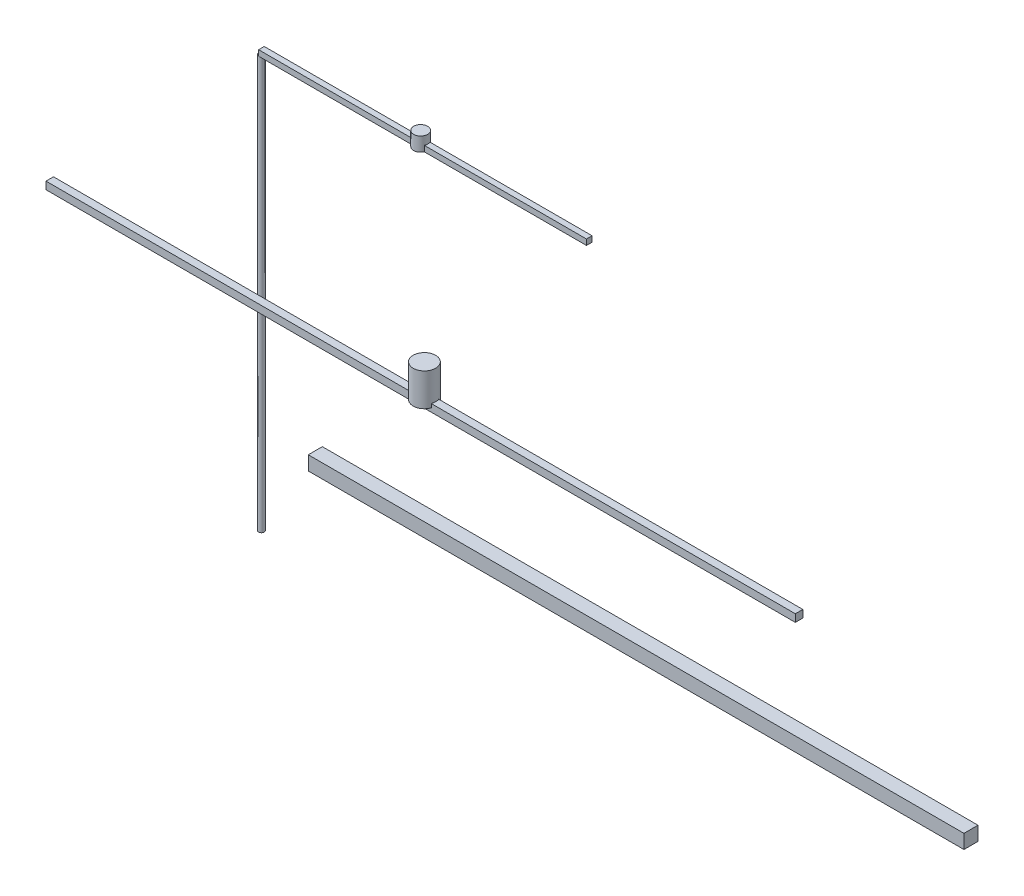
ISO-10303-21;
HEADER;
FILE_DESCRIPTION(('STEP AP214'),'2;1');
FILE_NAME('part.step','',(''),(''),'','','');
FILE_SCHEMA(('AUTOMOTIVE_DESIGN { 1 0 10303 214 1 1 1 1 }'));
ENDSEC;
DATA;
#1=APPLICATION_CONTEXT('core data for automotive mechanical design processes');
#2=APPLICATION_PROTOCOL_DEFINITION('international standard','automotive_design',2000,#1);
#3=PRODUCT_CONTEXT('',#1,'mechanical');
#4=PRODUCT('Part','Part','',(#3));
#5=PRODUCT_RELATED_PRODUCT_CATEGORY('part','',(#4));
#6=PRODUCT_DEFINITION_FORMATION('','',#4);
#7=PRODUCT_DEFINITION_CONTEXT('part definition',#1,'design');
#8=PRODUCT_DEFINITION('design','',#6,#7);
#9=PRODUCT_DEFINITION_SHAPE('','',#8);
#10=(LENGTH_UNIT() NAMED_UNIT(*) SI_UNIT(.MILLI.,.METRE.));
#11=(NAMED_UNIT(*) PLANE_ANGLE_UNIT() SI_UNIT($,.RADIAN.));
#12=(NAMED_UNIT(*) SI_UNIT($,.STERADIAN.) SOLID_ANGLE_UNIT());
#13=UNCERTAINTY_MEASURE_WITH_UNIT(LENGTH_MEASURE(1.E-05),#10,'distance_accuracy_value','');
#14=(GEOMETRIC_REPRESENTATION_CONTEXT(3) GLOBAL_UNCERTAINTY_ASSIGNED_CONTEXT((#13)) GLOBAL_UNIT_ASSIGNED_CONTEXT((#10,
#11,#12)) REPRESENTATION_CONTEXT('',''));
#15=CARTESIAN_POINT('',(0.,0.,0.));
#16=DIRECTION('',(0.,0.,1.));
#17=DIRECTION('',(1.,0.,0.));
#18=AXIS2_PLACEMENT_3D('',#15,#16,#17);
#19=CARTESIAN_POINT('',(-3500.,450.,-500.));
#20=DIRECTION('',(1.,0.,0.));
#21=DIRECTION('',(0.,0.,-1.));
#22=AXIS2_PLACEMENT_3D('',#19,#20,#21);
#23=PLANE('',#22);
#24=DIRECTION('',(0.,0.,1.));
#25=VECTOR('',#24,1.);
#26=CARTESIAN_POINT('',(-3500.,300.,-500.));
#27=LINE('',#26,#25);
#28=CARTESIAN_POINT('',(-3500.,300.,-650.));
#29=VERTEX_POINT('',#28);
#30=CARTESIAN_POINT('',(-3500.,300.,-500.));
#31=VERTEX_POINT('',#30);
#32=EDGE_CURVE('E113',#29,#31,#27,.T.);
#33=ORIENTED_EDGE('',*,*,#32,.T.);
#34=DIRECTION('',(0.,-1.,0.));
#35=VECTOR('',#34,1.);
#36=CARTESIAN_POINT('',(-3500.,450.,-500.));
#37=LINE('',#36,#35);
#38=CARTESIAN_POINT('',(-3500.,450.,-500.));
#39=VERTEX_POINT('',#38);
#40=EDGE_CURVE('E12',#39,#31,#37,.T.);
#41=ORIENTED_EDGE('',*,*,#40,.F.);
#42=DIRECTION('',(0.,0.,1.));
#43=VECTOR('',#42,1.);
#44=CARTESIAN_POINT('',(-3500.,450.,-500.));
#45=LINE('',#44,#43);
#46=CARTESIAN_POINT('',(-3500.,450.,-650.));
#47=VERTEX_POINT('',#46);
#48=EDGE_CURVE('E101',#47,#39,#45,.T.);
#49=ORIENTED_EDGE('',*,*,#48,.F.);
#50=DIRECTION('',(0.,-1.,0.));
#51=VECTOR('',#50,1.);
#52=CARTESIAN_POINT('',(-3500.,450.,-650.));
#53=LINE('',#52,#51);
#54=EDGE_CURVE('E109',#47,#29,#53,.T.);
#55=ORIENTED_EDGE('',*,*,#54,.T.);
#56=EDGE_LOOP('',(#33,#41,#49,#55));
#57=FACE_BOUND('',#56,.T.);
#58=ADVANCED_FACE('F50',(#57),#23,.F.);
#59=CARTESIAN_POINT('',(-3500.,450.,-500.));
#60=DIRECTION('',(0.,0.,-1.));
#61=DIRECTION('',(-1.,0.,0.));
#62=AXIS2_PLACEMENT_3D('',#59,#60,#61);
#63=PLANE('',#62);
#64=DIRECTION('',(1.,0.,0.));
#65=VECTOR('',#64,1.);
#66=CARTESIAN_POINT('',(-3500.,300.,-500.));
#67=LINE('',#66,#65);
#68=CARTESIAN_POINT('',(3500.,300.,-500.));
#69=VERTEX_POINT('',#68);
#70=EDGE_CURVE('E105',#31,#69,#67,.T.);
#71=ORIENTED_EDGE('',*,*,#70,.T.);
#72=DIRECTION('',(0.,-1.,0.));
#73=VECTOR('',#72,1.);
#74=CARTESIAN_POINT('',(3500.,450.,-500.));
#75=LINE('',#74,#73);
#76=CARTESIAN_POINT('',(3500.,450.,-500.));
#77=VERTEX_POINT('',#76);
#78=EDGE_CURVE('E58',#77,#69,#75,.T.);
#79=ORIENTED_EDGE('',*,*,#78,.F.);
#80=DIRECTION('',(1.,0.,0.));
#81=VECTOR('',#80,1.);
#82=CARTESIAN_POINT('',(-3500.,450.,-500.));
#83=LINE('',#82,#81);
#84=EDGE_CURVE('E96',#39,#77,#83,.T.);
#85=ORIENTED_EDGE('',*,*,#84,.F.);
#86=ORIENTED_EDGE('',*,*,#40,.T.);
#87=EDGE_LOOP('',(#71,#79,#85,#86));
#88=FACE_BOUND('',#87,.T.);
#89=ADVANCED_FACE('F104',(#88),#63,.F.);
#90=CARTESIAN_POINT('',(3500.,450.,-500.));
#91=DIRECTION('',(-1.,0.,0.));
#92=DIRECTION('',(0.,0.,1.));
#93=AXIS2_PLACEMENT_3D('',#90,#91,#92);
#94=PLANE('',#93);
#95=DIRECTION('',(0.,0.,-1.));
#96=VECTOR('',#95,1.);
#97=CARTESIAN_POINT('',(3500.,300.,-500.));
#98=LINE('',#97,#96);
#99=CARTESIAN_POINT('',(3500.,300.,-650.));
#100=VERTEX_POINT('',#99);
#101=EDGE_CURVE('E83',#69,#100,#98,.T.);
#102=ORIENTED_EDGE('',*,*,#101,.T.);
#103=DIRECTION('',(0.,-1.,0.));
#104=VECTOR('',#103,1.);
#105=CARTESIAN_POINT('',(3500.,450.,-650.));
#106=LINE('',#105,#104);
#107=CARTESIAN_POINT('',(3500.,450.,-650.));
#108=VERTEX_POINT('',#107);
#109=EDGE_CURVE('E106',#108,#100,#106,.T.);
#110=ORIENTED_EDGE('',*,*,#109,.F.);
#111=DIRECTION('',(0.,0.,-1.));
#112=VECTOR('',#111,1.);
#113=CARTESIAN_POINT('',(3500.,450.,-500.));
#114=LINE('',#113,#112);
#115=EDGE_CURVE('E99',#77,#108,#114,.T.);
#116=ORIENTED_EDGE('',*,*,#115,.F.);
#117=ORIENTED_EDGE('',*,*,#78,.T.);
#118=EDGE_LOOP('',(#102,#110,#116,#117));
#119=FACE_BOUND('',#118,.T.);
#120=ADVANCED_FACE('F107',(#119),#94,.F.);
#121=CARTESIAN_POINT('',(-3500.,450.,-650.));
#122=DIRECTION('',(0.,0.,1.));
#123=DIRECTION('',(1.,0.,0.));
#124=AXIS2_PLACEMENT_3D('',#121,#122,#123);
#125=PLANE('',#124);
#126=DIRECTION('',(-1.,0.,0.));
#127=VECTOR('',#126,1.);
#128=CARTESIAN_POINT('',(-3500.,300.,-650.));
#129=LINE('',#128,#127);
#130=EDGE_CURVE('E89',#100,#29,#129,.T.);
#131=ORIENTED_EDGE('',*,*,#130,.T.);
#132=ORIENTED_EDGE('',*,*,#54,.F.);
#133=DIRECTION('',(-1.,0.,0.));
#134=VECTOR('',#133,1.);
#135=CARTESIAN_POINT('',(-3500.,450.,-650.));
#136=LINE('',#135,#134);
#137=EDGE_CURVE('E66',#108,#47,#136,.T.);
#138=ORIENTED_EDGE('',*,*,#137,.F.);
#139=ORIENTED_EDGE('',*,*,#109,.T.);
#140=EDGE_LOOP('',(#131,#132,#138,#139));
#141=FACE_BOUND('',#140,.T.);
#142=ADVANCED_FACE('F120',(#141),#125,.F.);
#143=CARTESIAN_POINT('',(0.,450.,0.));
#144=DIRECTION('',(0.,-1.,0.));
#145=DIRECTION('',(0.,0.,-1.));
#146=AXIS2_PLACEMENT_3D('',#143,#144,#145);
#147=PLANE('',#146);
#148=ORIENTED_EDGE('',*,*,#48,.T.);
#149=ORIENTED_EDGE('',*,*,#84,.T.);
#150=ORIENTED_EDGE('',*,*,#115,.T.);
#151=ORIENTED_EDGE('',*,*,#137,.T.);
#152=EDGE_LOOP('',(#148,#149,#150,#151));
#153=FACE_BOUND('',#152,.T.);
#154=ADVANCED_FACE('F97',(#153),#147,.F.);
#155=CARTESIAN_POINT('',(0.,300.,0.));
#156=DIRECTION('',(0.,-1.,0.));
#157=DIRECTION('',(0.,0.,-1.));
#158=AXIS2_PLACEMENT_3D('',#155,#156,#157);
#159=PLANE('',#158);
#160=ORIENTED_EDGE('',*,*,#32,.F.);
#161=ORIENTED_EDGE('',*,*,#130,.F.);
#162=ORIENTED_EDGE('',*,*,#101,.F.);
#163=ORIENTED_EDGE('',*,*,#70,.F.);
#164=EDGE_LOOP('',(#160,#161,#162,#163));
#165=FACE_BOUND('',#164,.T.);
#166=ADVANCED_FACE('F123',(#165),#159,.T.);
#167=CLOSED_SHELL('',(#58,#89,#120,#142,#154,#166));
#168=MANIFOLD_SOLID_BREP('B2',#167);
#169=CARTESIAN_POINT('',(-4000.,3880.,1800.));
#170=DIRECTION('',(0.,0.,-1.));
#171=DIRECTION('',(-1.,0.,0.));
#172=AXIS2_PLACEMENT_3D('',#169,#170,#171);
#173=PLANE('',#172);
#174=DIRECTION('',(0.,-1.,0.));
#175=VECTOR('',#174,1.);
#176=CARTESIAN_POINT('',(113.137084989848,4190.,1800.));
#177=LINE('',#176,#175);
#178=CARTESIAN_POINT('',(113.137084989848,3840.,1800.));
#179=VERTEX_POINT('',#178);
#180=CARTESIAN_POINT('',(113.137084989848,3880.,1800.));
#181=VERTEX_POINT('',#180);
#182=EDGE_CURVE('E198',#179,#181,#177,.F.);
#183=ORIENTED_EDGE('',*,*,#182,.F.);
#184=DIRECTION('',(1.,0.,0.));
#185=VECTOR('',#184,1.);
#186=CARTESIAN_POINT('',(-4000.,3840.,1800.));
#187=LINE('',#186,#185);
#188=CARTESIAN_POINT('',(-113.137084989848,3840.,1800.));
#189=VERTEX_POINT('',#188);
#190=EDGE_CURVE('E202',#189,#179,#187,.T.);
#191=ORIENTED_EDGE('',*,*,#190,.F.);
#192=DIRECTION('',(0.,-1.,0.));
#193=VECTOR('',#192,1.);
#194=CARTESIAN_POINT('',(-113.137084989848,4190.,1800.));
#195=LINE('',#194,#193);
#196=CARTESIAN_POINT('',(-113.137084989848,3880.,1800.));
#197=VERTEX_POINT('',#196);
#198=EDGE_CURVE('E299',#197,#189,#195,.T.);
#199=ORIENTED_EDGE('',*,*,#198,.F.);
#200=DIRECTION('',(1.,0.,0.));
#201=VECTOR('',#200,1.);
#202=CARTESIAN_POINT('',(-4000.,3880.,1800.));
#203=LINE('',#202,#201);
#204=CARTESIAN_POINT('',(-4000.,3880.,1800.));
#205=VERTEX_POINT('',#204);
#206=EDGE_CURVE('E292',#205,#197,#203,.T.);
#207=ORIENTED_EDGE('',*,*,#206,.F.);
#208=DIRECTION('',(0.,-1.,0.));
#209=VECTOR('',#208,1.);
#210=CARTESIAN_POINT('',(-4000.,3880.,1800.));
#211=LINE('',#210,#209);
#212=CARTESIAN_POINT('',(-4000.,3800.,1800.));
#213=VERTEX_POINT('',#212);
#214=EDGE_CURVE('E270',#205,#213,#211,.T.);
#215=ORIENTED_EDGE('',*,*,#214,.T.);
#216=DIRECTION('',(1.,0.,0.));
#217=VECTOR('',#216,1.);
#218=CARTESIAN_POINT('',(-4000.,3800.,1800.));
#219=LINE('',#218,#217);
#220=CARTESIAN_POINT('',(4000.,3800.,1800.));
#221=VERTEX_POINT('',#220);
#222=EDGE_CURVE('E286',#213,#221,#219,.T.);
#223=ORIENTED_EDGE('',*,*,#222,.T.);
#224=DIRECTION('',(0.,-1.,0.));
#225=VECTOR('',#224,1.);
#226=CARTESIAN_POINT('',(4000.,3880.,1800.));
#227=LINE('',#226,#225);
#228=CARTESIAN_POINT('',(4000.,3880.,1800.));
#229=VERTEX_POINT('',#228);
#230=EDGE_CURVE('E272',#229,#221,#227,.T.);
#231=ORIENTED_EDGE('',*,*,#230,.F.);
#232=EDGE_CURVE('E295',#181,#229,#203,.T.);
#233=ORIENTED_EDGE('',*,*,#232,.F.);
#234=EDGE_LOOP('',(#183,#191,#199,#207,#215,#223,#231,#233));
#235=FACE_BOUND('',#234,.T.);
#236=ADVANCED_FACE('F183',(#235),#173,.F.);
#237=CARTESIAN_POINT('',(-4000.,3880.,1720.));
#238=DIRECTION('',(0.,0.,1.));
#239=DIRECTION('',(1.,0.,0.));
#240=AXIS2_PLACEMENT_3D('',#237,#238,#239);
#241=PLANE('',#240);
#242=DIRECTION('',(0.,-1.,0.));
#243=VECTOR('',#242,1.);
#244=CARTESIAN_POINT('',(-113.137084989848,4190.,1720.));
#245=LINE('',#244,#243);
#246=CARTESIAN_POINT('',(-113.137084989848,3840.,1720.));
#247=VERTEX_POINT('',#246);
#248=CARTESIAN_POINT('',(-113.137084989848,3880.,1720.));
#249=VERTEX_POINT('',#248);
#250=EDGE_CURVE('E301',#247,#249,#245,.F.);
#251=ORIENTED_EDGE('',*,*,#250,.F.);
#252=DIRECTION('',(-1.,0.,0.));
#253=VECTOR('',#252,1.);
#254=CARTESIAN_POINT('',(-4000.,3840.,1720.));
#255=LINE('',#254,#253);
#256=CARTESIAN_POINT('',(113.137084989848,3840.,1720.));
#257=VERTEX_POINT('',#256);
#258=EDGE_CURVE('E48',#257,#247,#255,.T.);
#259=ORIENTED_EDGE('',*,*,#258,.F.);
#260=DIRECTION('',(0.,-1.,0.));
#261=VECTOR('',#260,1.);
#262=CARTESIAN_POINT('',(113.137084989848,4190.,1720.));
#263=LINE('',#262,#261);
#264=CARTESIAN_POINT('',(113.137084989848,3880.,1720.));
#265=VERTEX_POINT('',#264);
#266=EDGE_CURVE('E260',#265,#257,#263,.T.);
#267=ORIENTED_EDGE('',*,*,#266,.F.);
#268=DIRECTION('',(-1.,0.,0.));
#269=VECTOR('',#268,1.);
#270=CARTESIAN_POINT('',(-4000.,3880.,1720.));
#271=LINE('',#270,#269);
#272=CARTESIAN_POINT('',(4000.,3880.,1720.));
#273=VERTEX_POINT('',#272);
#274=EDGE_CURVE('E246',#273,#265,#271,.T.);
#275=ORIENTED_EDGE('',*,*,#274,.F.);
#276=DIRECTION('',(0.,-1.,0.));
#277=VECTOR('',#276,1.);
#278=CARTESIAN_POINT('',(4000.,3880.,1720.));
#279=LINE('',#278,#277);
#280=CARTESIAN_POINT('',(4000.,3800.,1720.));
#281=VERTEX_POINT('',#280);
#282=EDGE_CURVE('E277',#273,#281,#279,.T.);
#283=ORIENTED_EDGE('',*,*,#282,.T.);
#284=DIRECTION('',(-1.,0.,0.));
#285=VECTOR('',#284,1.);
#286=CARTESIAN_POINT('',(-4000.,3800.,1720.));
#287=LINE('',#286,#285);
#288=CARTESIAN_POINT('',(-4000.,3800.,1720.));
#289=VERTEX_POINT('',#288);
#290=EDGE_CURVE('E281',#281,#289,#287,.T.);
#291=ORIENTED_EDGE('',*,*,#290,.T.);
#292=DIRECTION('',(0.,-1.,0.));
#293=VECTOR('',#292,1.);
#294=CARTESIAN_POINT('',(-4000.,3880.,1720.));
#295=LINE('',#294,#293);
#296=CARTESIAN_POINT('',(-4000.,3880.,1720.));
#297=VERTEX_POINT('',#296);
#298=EDGE_CURVE('E256',#297,#289,#295,.T.);
#299=ORIENTED_EDGE('',*,*,#298,.F.);
#300=EDGE_CURVE('E257',#249,#297,#271,.T.);
#301=ORIENTED_EDGE('',*,*,#300,.F.);
#302=EDGE_LOOP('',(#251,#259,#267,#275,#283,#291,#299,#301));
#303=FACE_BOUND('',#302,.T.);
#304=ADVANCED_FACE('F261',(#303),#241,.F.);
#305=CARTESIAN_POINT('',(0.,3880.,0.));
#306=DIRECTION('',(0.,-1.,0.));
#307=DIRECTION('',(0.,0.,-1.));
#308=AXIS2_PLACEMENT_3D('',#305,#306,#307);
#309=PLANE('',#308);
#310=CARTESIAN_POINT('',(0.,3880.,1760.));
#311=DIRECTION('',(0.,-1.,0.));
#312=DIRECTION('',(0.,0.,-1.));
#313=AXIS2_PLACEMENT_3D('',#310,#311,#312);
#314=CIRCLE('',#313,120.);
#315=EDGE_CURVE('E191',#249,#197,#314,.F.);
#316=ORIENTED_EDGE('',*,*,#315,.F.);
#317=ORIENTED_EDGE('',*,*,#300,.T.);
#318=DIRECTION('',(0.,0.,1.));
#319=VECTOR('',#318,1.);
#320=CARTESIAN_POINT('',(-4000.,3880.,1800.));
#321=LINE('',#320,#319);
#322=EDGE_CURVE('E283',#297,#205,#321,.T.);
#323=ORIENTED_EDGE('',*,*,#322,.T.);
#324=ORIENTED_EDGE('',*,*,#206,.T.);
#325=EDGE_LOOP('',(#316,#317,#323,#324));
#326=FACE_BOUND('',#325,.T.);
#327=ADVANCED_FACE('F331',(#326),#309,.F.);
#328=CARTESIAN_POINT('',(-4000.,3880.,1800.));
#329=DIRECTION('',(1.,0.,0.));
#330=DIRECTION('',(0.,0.,-1.));
#331=AXIS2_PLACEMENT_3D('',#328,#329,#330);
#332=PLANE('',#331);
#333=DIRECTION('',(0.,0.,1.));
#334=VECTOR('',#333,1.);
#335=CARTESIAN_POINT('',(-4000.,3800.,1800.));
#336=LINE('',#335,#334);
#337=EDGE_CURVE('E288',#289,#213,#336,.T.);
#338=ORIENTED_EDGE('',*,*,#337,.T.);
#339=ORIENTED_EDGE('',*,*,#214,.F.);
#340=ORIENTED_EDGE('',*,*,#322,.F.);
#341=ORIENTED_EDGE('',*,*,#298,.T.);
#342=EDGE_LOOP('',(#338,#339,#340,#341));
#343=FACE_BOUND('',#342,.T.);
#344=ADVANCED_FACE('F185',(#343),#332,.F.);
#345=CARTESIAN_POINT('',(4000.,3880.,1800.));
#346=DIRECTION('',(-1.,0.,0.));
#347=DIRECTION('',(0.,0.,1.));
#348=AXIS2_PLACEMENT_3D('',#345,#346,#347);
#349=PLANE('',#348);
#350=DIRECTION('',(0.,0.,-1.));
#351=VECTOR('',#350,1.);
#352=CARTESIAN_POINT('',(4000.,3800.,1800.));
#353=LINE('',#352,#351);
#354=EDGE_CURVE('E284',#221,#281,#353,.T.);
#355=ORIENTED_EDGE('',*,*,#354,.T.);
#356=ORIENTED_EDGE('',*,*,#282,.F.);
#357=DIRECTION('',(0.,0.,-1.));
#358=VECTOR('',#357,1.);
#359=CARTESIAN_POINT('',(4000.,3880.,1800.));
#360=LINE('',#359,#358);
#361=EDGE_CURVE('E252',#229,#273,#360,.T.);
#362=ORIENTED_EDGE('',*,*,#361,.F.);
#363=ORIENTED_EDGE('',*,*,#230,.T.);
#364=EDGE_LOOP('',(#355,#356,#362,#363));
#365=FACE_BOUND('',#364,.T.);
#366=ADVANCED_FACE('F334',(#365),#349,.F.);
#367=EDGE_CURVE('E250',#181,#265,#314,.F.);
#368=ORIENTED_EDGE('',*,*,#367,.F.);
#369=ORIENTED_EDGE('',*,*,#232,.T.);
#370=ORIENTED_EDGE('',*,*,#361,.T.);
#371=ORIENTED_EDGE('',*,*,#274,.T.);
#372=EDGE_LOOP('',(#368,#369,#370,#371));
#373=FACE_BOUND('',#372,.T.);
#374=ADVANCED_FACE('F248',(#373),#309,.F.);
#375=CARTESIAN_POINT('',(0.,3800.,0.));
#376=DIRECTION('',(0.,-1.,0.));
#377=DIRECTION('',(0.,0.,-1.));
#378=AXIS2_PLACEMENT_3D('',#375,#376,#377);
#379=PLANE('',#378);
#380=ORIENTED_EDGE('',*,*,#337,.F.);
#381=ORIENTED_EDGE('',*,*,#290,.F.);
#382=ORIENTED_EDGE('',*,*,#354,.F.);
#383=ORIENTED_EDGE('',*,*,#222,.F.);
#384=EDGE_LOOP('',(#380,#381,#382,#383));
#385=FACE_BOUND('',#384,.T.);
#386=ADVANCED_FACE('F323',(#385),#379,.T.);
#387=CARTESIAN_POINT('',(0.,3840.,1760.));
#388=DIRECTION('',(0.,1.,0.));
#389=DIRECTION('',(0.,0.,1.));
#390=AXIS2_PLACEMENT_3D('',#387,#388,#389);
#391=PLANE('',#390);
#392=CARTESIAN_POINT('',(0.,3840.,1760.));
#393=DIRECTION('',(0.,1.,0.));
#394=DIRECTION('',(0.,0.,1.));
#395=AXIS2_PLACEMENT_3D('',#392,#393,#394);
#396=CIRCLE('',#395,120.);
#397=EDGE_CURVE('E305',#189,#179,#396,.T.);
#398=ORIENTED_EDGE('',*,*,#397,.F.);
#399=ORIENTED_EDGE('',*,*,#190,.T.);
#400=EDGE_LOOP('',(#398,#399));
#401=FACE_BOUND('',#400,.T.);
#402=ADVANCED_FACE('F314',(#401),#391,.F.);
#403=EDGE_CURVE('E307',#257,#247,#396,.T.);
#404=ORIENTED_EDGE('',*,*,#403,.F.);
#405=ORIENTED_EDGE('',*,*,#258,.T.);
#406=EDGE_LOOP('',(#404,#405));
#407=FACE_BOUND('',#406,.T.);
#408=ADVANCED_FACE('F312',(#407),#391,.F.);
#409=CARTESIAN_POINT('',(0.,4190.,1760.));
#410=DIRECTION('',(0.,-1.,0.));
#411=DIRECTION('',(0.,0.,-1.));
#412=AXIS2_PLACEMENT_3D('',#409,#410,#411);
#413=CYLINDRICAL_SURFACE('',#412,120.);
#414=CARTESIAN_POINT('',(0.,4190.,1760.));
#415=DIRECTION('',(0.,1.,0.));
#416=DIRECTION('',(0.,0.,1.));
#417=AXIS2_PLACEMENT_3D('',#414,#415,#416);
#418=CIRCLE('',#417,120.);
#419=CARTESIAN_POINT('',(0.,4190.,1880.));
#420=VERTEX_POINT('',#419);
#421=EDGE_CURVE('E265',#420,#420,#418,.T.);
#422=ORIENTED_EDGE('',*,*,#421,.F.);
#423=EDGE_LOOP('',(#422));
#424=FACE_BOUND('',#423,.T.);
#425=ORIENTED_EDGE('',*,*,#315,.T.);
#426=ORIENTED_EDGE('',*,*,#198,.T.);
#427=ORIENTED_EDGE('',*,*,#397,.T.);
#428=ORIENTED_EDGE('',*,*,#182,.T.);
#429=ORIENTED_EDGE('',*,*,#367,.T.);
#430=ORIENTED_EDGE('',*,*,#266,.T.);
#431=ORIENTED_EDGE('',*,*,#403,.T.);
#432=ORIENTED_EDGE('',*,*,#250,.T.);
#433=EDGE_LOOP('',(#425,#426,#427,#428,#429,#430,#431,#432));
#434=FACE_BOUND('',#433,.T.);
#435=ADVANCED_FACE('F268',(#424,#434),#413,.T.);
#436=CARTESIAN_POINT('',(0.,4190.,1760.));
#437=DIRECTION('',(0.,1.,0.));
#438=DIRECTION('',(0.,0.,1.));
#439=AXIS2_PLACEMENT_3D('',#436,#437,#438);
#440=PLANE('',#439);
#441=ORIENTED_EDGE('',*,*,#421,.T.);
#442=EDGE_LOOP('',(#441));
#443=FACE_BOUND('',#442,.T.);
#444=ADVANCED_FACE('F320',(#443),#440,.T.);
#445=CLOSED_SHELL('',(#236,#304,#327,#344,#366,#374,#386,#402,#408,#435,#444));
#446=MANIFOLD_SOLID_BREP('B6',#445);
#447=CARTESIAN_POINT('',(-3500.,4460.,29.9999999999998));
#448=DIRECTION('',(0.,0.,-1.));
#449=DIRECTION('',(-1.,0.,0.));
#450=AXIS2_PLACEMENT_3D('',#447,#448,#449);
#451=PLANE('',#450);
#452=DIRECTION('',(0.,-1.,0.));
#453=VECTOR('',#452,1.);
#454=CARTESIAN_POINT('',(-1731.26136457566,4550.,29.9999999999998));
#455=LINE('',#454,#453);
#456=CARTESIAN_POINT('',(-1731.26136457566,4400.,29.9999999999998));
#457=VERTEX_POINT('',#456);
#458=CARTESIAN_POINT('',(-1731.26136457566,4460.,29.9999999999998));
#459=VERTEX_POINT('',#458);
#460=EDGE_CURVE('E504',#457,#459,#455,.F.);
#461=ORIENTED_EDGE('',*,*,#460,.F.);
#462=DIRECTION('',(1.,0.,0.));
#463=VECTOR('',#462,1.);
#464=CARTESIAN_POINT('',(-3500.,4400.,29.9999999999998));
#465=LINE('',#464,#463);
#466=CARTESIAN_POINT('',(0.,4400.,29.9999999999998));
#467=VERTEX_POINT('',#466);
#468=EDGE_CURVE('E533',#457,#467,#465,.T.);
#469=ORIENTED_EDGE('',*,*,#468,.T.);
#470=DIRECTION('',(0.,-1.,0.));
#471=VECTOR('',#470,1.);
#472=CARTESIAN_POINT('',(0.,4460.,29.9999999999998));
#473=LINE('',#472,#471);
#474=CARTESIAN_POINT('',(0.,4460.,29.9999999999998));
#475=VERTEX_POINT('',#474);
#476=EDGE_CURVE('E544',#475,#467,#473,.T.);
#477=ORIENTED_EDGE('',*,*,#476,.F.);
#478=DIRECTION('',(1.,0.,0.));
#479=VECTOR('',#478,1.);
#480=CARTESIAN_POINT('',(-3500.,4460.,29.9999999999998));
#481=LINE('',#480,#479);
#482=EDGE_CURVE('E527',#459,#475,#481,.T.);
#483=ORIENTED_EDGE('',*,*,#482,.F.);
#484=EDGE_LOOP('',(#461,#469,#477,#483));
#485=FACE_BOUND('',#484,.T.);
#486=ADVANCED_FACE('F420',(#485),#451,.F.);
#487=DIRECTION('',(0.,-1.,0.));
#488=VECTOR('',#487,1.);
#489=CARTESIAN_POINT('',(-1868.73863542434,4550.,29.9999999999998));
#490=LINE('',#489,#488);
#491=CARTESIAN_POINT('',(-1868.73863542434,4460.,29.9999999999998));
#492=VERTEX_POINT('',#491);
#493=CARTESIAN_POINT('',(-1868.73863542434,4400.,29.9999999999998));
#494=VERTEX_POINT('',#493);
#495=EDGE_CURVE('E518',#492,#494,#490,.T.);
#496=ORIENTED_EDGE('',*,*,#495,.F.);
#497=CARTESIAN_POINT('',(-3500.,4460.,29.9999999999998));
#498=VERTEX_POINT('',#497);
#499=EDGE_CURVE('E528',#498,#492,#481,.T.);
#500=ORIENTED_EDGE('',*,*,#499,.F.);
#501=DIRECTION('',(0.,-1.,0.));
#502=VECTOR('',#501,1.);
#503=CARTESIAN_POINT('',(-3500.,4460.,29.9999999999998));
#504=LINE('',#503,#502);
#505=CARTESIAN_POINT('',(-3500.,4400.,29.9999999999998));
#506=VERTEX_POINT('',#505);
#507=EDGE_CURVE('E547',#498,#506,#504,.T.);
#508=ORIENTED_EDGE('',*,*,#507,.T.);
#509=EDGE_CURVE('E534',#506,#494,#465,.T.);
#510=ORIENTED_EDGE('',*,*,#509,.T.);
#511=EDGE_LOOP('',(#496,#500,#508,#510));
#512=FACE_BOUND('',#511,.T.);
#513=ADVANCED_FACE('F567',(#512),#451,.F.);
#514=CARTESIAN_POINT('',(-3500.,4460.,-29.9999999999998));
#515=DIRECTION('',(0.,0.,1.));
#516=DIRECTION('',(1.,0.,0.));
#517=AXIS2_PLACEMENT_3D('',#514,#515,#516);
#518=PLANE('',#517);
#519=DIRECTION('',(0.,-1.,0.));
#520=VECTOR('',#519,1.);
#521=CARTESIAN_POINT('',(-1868.73863542434,4550.,-29.9999999999998));
#522=LINE('',#521,#520);
#523=CARTESIAN_POINT('',(-1868.73863542434,4400.,-29.9999999999998));
#524=VERTEX_POINT('',#523);
#525=CARTESIAN_POINT('',(-1868.73863542434,4460.,-29.9999999999998));
#526=VERTEX_POINT('',#525);
#527=EDGE_CURVE('E515',#524,#526,#522,.F.);
#528=ORIENTED_EDGE('',*,*,#527,.F.);
#529=DIRECTION('',(-1.,0.,0.));
#530=VECTOR('',#529,1.);
#531=CARTESIAN_POINT('',(-3500.,4400.,-29.9999999999998));
#532=LINE('',#531,#530);
#533=CARTESIAN_POINT('',(-3500.,4400.,-29.9999999999998));
#534=VERTEX_POINT('',#533);
#535=EDGE_CURVE('E538',#524,#534,#532,.T.);
#536=ORIENTED_EDGE('',*,*,#535,.T.);
#537=DIRECTION('',(0.,-1.,0.));
#538=VECTOR('',#537,1.);
#539=CARTESIAN_POINT('',(-3500.,4460.,-29.9999999999998));
#540=LINE('',#539,#538);
#541=CARTESIAN_POINT('',(-3500.,4460.,-29.9999999999998));
#542=VERTEX_POINT('',#541);
#543=EDGE_CURVE('E493',#542,#534,#540,.T.);
#544=ORIENTED_EDGE('',*,*,#543,.F.);
#545=DIRECTION('',(-1.,0.,0.));
#546=VECTOR('',#545,1.);
#547=CARTESIAN_POINT('',(-3500.,4460.,-29.9999999999998));
#548=LINE('',#547,#546);
#549=EDGE_CURVE('E494',#526,#542,#548,.T.);
#550=ORIENTED_EDGE('',*,*,#549,.F.);
#551=EDGE_LOOP('',(#528,#536,#544,#550));
#552=FACE_BOUND('',#551,.T.);
#553=ADVANCED_FACE('F571',(#552),#518,.F.);
#554=DIRECTION('',(0.,-1.,0.));
#555=VECTOR('',#554,1.);
#556=CARTESIAN_POINT('',(-1731.26136457566,4550.,-29.9999999999998));
#557=LINE('',#556,#555);
#558=CARTESIAN_POINT('',(-1731.26136457566,4460.,-29.9999999999998));
#559=VERTEX_POINT('',#558);
#560=CARTESIAN_POINT('',(-1731.26136457566,4400.,-29.9999999999998));
#561=VERTEX_POINT('',#560);
#562=EDGE_CURVE('E497',#559,#561,#557,.T.);
#563=ORIENTED_EDGE('',*,*,#562,.F.);
#564=CARTESIAN_POINT('',(0.,4460.,-29.9999999999998));
#565=VERTEX_POINT('',#564);
#566=EDGE_CURVE('E485',#565,#559,#548,.T.);
#567=ORIENTED_EDGE('',*,*,#566,.F.);
#568=DIRECTION('',(0.,-1.,0.));
#569=VECTOR('',#568,1.);
#570=CARTESIAN_POINT('',(0.,4460.,-29.9999999999998));
#571=LINE('',#570,#569);
#572=CARTESIAN_POINT('',(0.,4400.,-29.9999999999998));
#573=VERTEX_POINT('',#572);
#574=EDGE_CURVE('E542',#565,#573,#571,.T.);
#575=ORIENTED_EDGE('',*,*,#574,.T.);
#576=EDGE_CURVE('E500',#573,#561,#532,.T.);
#577=ORIENTED_EDGE('',*,*,#576,.T.);
#578=EDGE_LOOP('',(#563,#567,#575,#577));
#579=FACE_BOUND('',#578,.T.);
#580=ADVANCED_FACE('F498',(#579),#518,.F.);
#581=CARTESIAN_POINT('',(0.,4460.,0.));
#582=DIRECTION('',(0.,-1.,0.));
#583=DIRECTION('',(0.,0.,-1.));
#584=AXIS2_PLACEMENT_3D('',#581,#582,#583);
#585=PLANE('',#584);
#586=CARTESIAN_POINT('',(-1800.,4460.,0.));
#587=DIRECTION('',(0.,-1.,0.));
#588=DIRECTION('',(0.,0.,-1.));
#589=AXIS2_PLACEMENT_3D('',#586,#587,#588);
#590=CIRCLE('',#589,75.);
#591=EDGE_CURVE('E436',#526,#492,#590,.F.);
#592=ORIENTED_EDGE('',*,*,#591,.F.);
#593=ORIENTED_EDGE('',*,*,#549,.T.);
#594=DIRECTION('',(0.,0.,1.));
#595=VECTOR('',#594,1.);
#596=CARTESIAN_POINT('',(-3500.,4460.,29.9999999999998));
#597=LINE('',#596,#595);
#598=EDGE_CURVE('E524',#542,#498,#597,.T.);
#599=ORIENTED_EDGE('',*,*,#598,.T.);
#600=ORIENTED_EDGE('',*,*,#499,.T.);
#601=EDGE_LOOP('',(#592,#593,#599,#600));
#602=FACE_BOUND('',#601,.T.);
#603=ADVANCED_FACE('F573',(#602),#585,.F.);
#604=CARTESIAN_POINT('',(-3500.,4400.,0.));
#605=DIRECTION('',(0.,-1.,0.));
#606=DIRECTION('',(0.,0.,-1.));
#607=AXIS2_PLACEMENT_3D('',#604,#605,#606);
#608=CYLINDRICAL_SURFACE('',#607,29.9999999999998);
#609=CARTESIAN_POINT('',(-3500.,4400.,0.));
#610=DIRECTION('',(0.,1.,0.));
#611=DIRECTION('',(0.,0.,1.));
#612=AXIS2_PLACEMENT_3D('',#609,#610,#611);
#613=CIRCLE('',#612,29.9999999999998);
#614=EDGE_CURVE('E181',#506,#534,#613,.T.);
#615=ORIENTED_EDGE('',*,*,#614,.F.);
#616=EDGE_CURVE('E429',#534,#506,#613,.T.);
#617=ORIENTED_EDGE('',*,*,#616,.F.);
#618=EDGE_LOOP('',(#615,#617));
#619=FACE_BOUND('',#618,.T.);
#620=CARTESIAN_POINT('',(-3500.,0.,0.));
#621=DIRECTION('',(0.,1.,0.));
#622=DIRECTION('',(0.,0.,1.));
#623=AXIS2_PLACEMENT_3D('',#620,#621,#622);
#624=CIRCLE('',#623,29.9999999999998);
#625=CARTESIAN_POINT('',(-3500.,0.,29.9999999999998));
#626=VERTEX_POINT('',#625);
#627=EDGE_CURVE('E424',#626,#626,#624,.T.);
#628=ORIENTED_EDGE('',*,*,#627,.T.);
#629=EDGE_LOOP('',(#628));
#630=FACE_BOUND('',#629,.T.);
#631=ADVANCED_FACE('F422',(#619,#630),#608,.T.);
#632=CARTESIAN_POINT('',(-3500.,4400.,0.));
#633=DIRECTION('',(0.,1.,0.));
#634=DIRECTION('',(0.,0.,1.));
#635=AXIS2_PLACEMENT_3D('',#632,#633,#634);
#636=PLANE('',#635);
#637=DIRECTION('',(0.,0.,1.));
#638=VECTOR('',#637,1.);
#639=CARTESIAN_POINT('',(-3500.,4400.,29.9999999999998));
#640=LINE('',#639,#638);
#641=EDGE_CURVE('E523',#534,#506,#640,.T.);
#642=ORIENTED_EDGE('',*,*,#641,.F.);
#643=ORIENTED_EDGE('',*,*,#616,.T.);
#644=EDGE_LOOP('',(#642,#643));
#645=FACE_BOUND('',#644,.T.);
#646=ADVANCED_FACE('F559',(#645),#636,.T.);
#647=CARTESIAN_POINT('',(-3500.,0.,0.));
#648=DIRECTION('',(0.,1.,0.));
#649=DIRECTION('',(0.,0.,1.));
#650=AXIS2_PLACEMENT_3D('',#647,#648,#649);
#651=PLANE('',#650);
#652=ORIENTED_EDGE('',*,*,#627,.F.);
#653=EDGE_LOOP('',(#652));
#654=FACE_BOUND('',#653,.T.);
#655=ADVANCED_FACE('F578',(#654),#651,.F.);
#656=CARTESIAN_POINT('',(-3500.,4460.,29.9999999999998));
#657=DIRECTION('',(1.,0.,0.));
#658=DIRECTION('',(0.,0.,-1.));
#659=AXIS2_PLACEMENT_3D('',#656,#657,#658);
#660=PLANE('',#659);
#661=ORIENTED_EDGE('',*,*,#641,.T.);
#662=ORIENTED_EDGE('',*,*,#507,.F.);
#663=ORIENTED_EDGE('',*,*,#598,.F.);
#664=ORIENTED_EDGE('',*,*,#543,.T.);
#665=EDGE_LOOP('',(#661,#662,#663,#664));
#666=FACE_BOUND('',#665,.T.);
#667=ADVANCED_FACE('F575',(#666),#660,.F.);
#668=CARTESIAN_POINT('',(0.,4460.,29.9999999999998));
#669=DIRECTION('',(-1.,0.,0.));
#670=DIRECTION('',(0.,0.,1.));
#671=AXIS2_PLACEMENT_3D('',#668,#669,#670);
#672=PLANE('',#671);
#673=DIRECTION('',(0.,0.,-1.));
#674=VECTOR('',#673,1.);
#675=CARTESIAN_POINT('',(0.,4400.,29.9999999999998));
#676=LINE('',#675,#674);
#677=EDGE_CURVE('E536',#467,#573,#676,.T.);
#678=ORIENTED_EDGE('',*,*,#677,.T.);
#679=ORIENTED_EDGE('',*,*,#574,.F.);
#680=DIRECTION('',(0.,0.,-1.));
#681=VECTOR('',#680,1.);
#682=CARTESIAN_POINT('',(0.,4460.,29.9999999999998));
#683=LINE('',#682,#681);
#684=EDGE_CURVE('E489',#475,#565,#683,.T.);
#685=ORIENTED_EDGE('',*,*,#684,.F.);
#686=ORIENTED_EDGE('',*,*,#476,.T.);
#687=EDGE_LOOP('',(#678,#679,#685,#686));
#688=FACE_BOUND('',#687,.T.);
#689=ADVANCED_FACE('F577',(#688),#672,.F.);
#690=EDGE_CURVE('E444',#459,#559,#590,.F.);
#691=ORIENTED_EDGE('',*,*,#690,.F.);
#692=ORIENTED_EDGE('',*,*,#482,.T.);
#693=ORIENTED_EDGE('',*,*,#684,.T.);
#694=ORIENTED_EDGE('',*,*,#566,.T.);
#695=EDGE_LOOP('',(#691,#692,#693,#694));
#696=FACE_BOUND('',#695,.T.);
#697=ADVANCED_FACE('F487',(#696),#585,.F.);
#698=CARTESIAN_POINT('',(0.,4400.,0.));
#699=DIRECTION('',(0.,-1.,0.));
#700=DIRECTION('',(0.,0.,-1.));
#701=AXIS2_PLACEMENT_3D('',#698,#699,#700);
#702=PLANE('',#701);
#703=ORIENTED_EDGE('',*,*,#468,.F.);
#704=CARTESIAN_POINT('',(-1800.,4400.,0.));
#705=DIRECTION('',(0.,1.,0.));
#706=DIRECTION('',(0.,0.,1.));
#707=AXIS2_PLACEMENT_3D('',#704,#705,#706);
#708=CIRCLE('',#707,75.);
#709=EDGE_CURVE('E566',#494,#457,#708,.T.);
#710=ORIENTED_EDGE('',*,*,#709,.F.);
#711=ORIENTED_EDGE('',*,*,#509,.F.);
#712=ORIENTED_EDGE('',*,*,#614,.T.);
#713=ORIENTED_EDGE('',*,*,#535,.F.);
#714=EDGE_CURVE('E512',#561,#524,#708,.T.);
#715=ORIENTED_EDGE('',*,*,#714,.F.);
#716=ORIENTED_EDGE('',*,*,#576,.F.);
#717=ORIENTED_EDGE('',*,*,#677,.F.);
#718=EDGE_LOOP('',(#703,#710,#711,#712,#713,#715,#716,#717));
#719=FACE_BOUND('',#718,.T.);
#720=ADVANCED_FACE('F564',(#719),#702,.T.);
#721=CARTESIAN_POINT('',(-1800.,4550.,0.));
#722=DIRECTION('',(0.,-1.,0.));
#723=DIRECTION('',(0.,0.,-1.));
#724=AXIS2_PLACEMENT_3D('',#721,#722,#723);
#725=CYLINDRICAL_SURFACE('',#724,75.);
#726=CARTESIAN_POINT('',(-1800.,4550.,0.));
#727=DIRECTION('',(0.,1.,0.));
#728=DIRECTION('',(0.,0.,1.));
#729=AXIS2_PLACEMENT_3D('',#726,#727,#728);
#730=CIRCLE('',#729,75.);
#731=CARTESIAN_POINT('',(-1800.,4550.,75.));
#732=VERTEX_POINT('',#731);
#733=EDGE_CURVE('E509',#732,#732,#730,.T.);
#734=ORIENTED_EDGE('',*,*,#733,.F.);
#735=EDGE_LOOP('',(#734));
#736=FACE_BOUND('',#735,.T.);
#737=ORIENTED_EDGE('',*,*,#591,.T.);
#738=ORIENTED_EDGE('',*,*,#495,.T.);
#739=ORIENTED_EDGE('',*,*,#709,.T.);
#740=ORIENTED_EDGE('',*,*,#460,.T.);
#741=ORIENTED_EDGE('',*,*,#690,.T.);
#742=ORIENTED_EDGE('',*,*,#562,.T.);
#743=ORIENTED_EDGE('',*,*,#714,.T.);
#744=ORIENTED_EDGE('',*,*,#527,.T.);
#745=EDGE_LOOP('',(#737,#738,#739,#740,#741,#742,#743,#744));
#746=FACE_BOUND('',#745,.T.);
#747=ADVANCED_FACE('F507',(#736,#746),#725,.T.);
#748=CARTESIAN_POINT('',(-1800.,4550.,0.));
#749=DIRECTION('',(0.,1.,0.));
#750=DIRECTION('',(0.,0.,1.));
#751=AXIS2_PLACEMENT_3D('',#748,#749,#750);
#752=PLANE('',#751);
#753=ORIENTED_EDGE('',*,*,#733,.T.);
#754=EDGE_LOOP('',(#753));
#755=FACE_BOUND('',#754,.T.);
#756=ADVANCED_FACE('F604',(#755),#752,.T.);
#757=CLOSED_SHELL('',(#486,#513,#553,#580,#603,#631,#646,#655,#667,#689,#697,#720,#747,#756));
#758=MANIFOLD_SOLID_BREP('B42',#757);
#759=ADVANCED_BREP_SHAPE_REPRESENTATION('',(#18,#168,#446,#758),#14);
#760=SHAPE_DEFINITION_REPRESENTATION(#9,#759);
ENDSEC;
END-ISO-10303-21;
